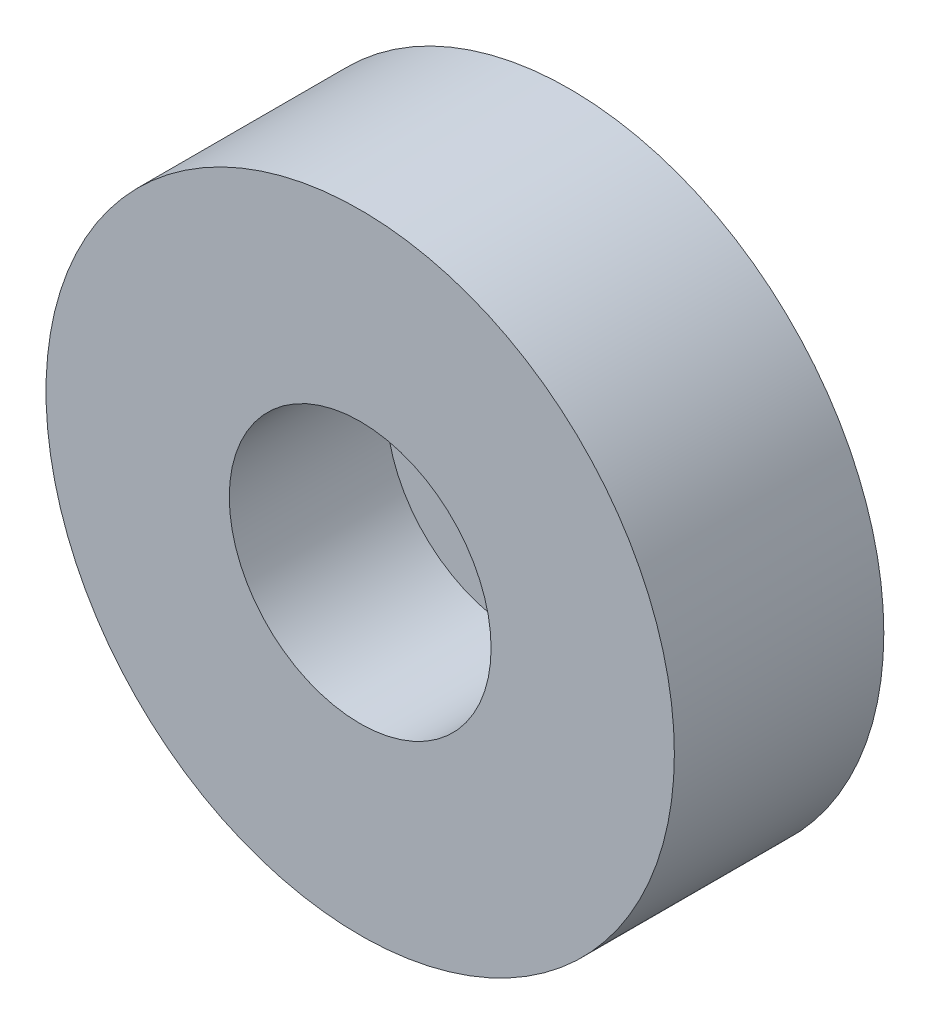
ISO-10303-21;
HEADER;
FILE_DESCRIPTION(('STEP AP214'),'2;1');
FILE_NAME('part.step','',(''),(''),'','','');
FILE_SCHEMA(('AUTOMOTIVE_DESIGN { 1 0 10303 214 1 1 1 1 }'));
ENDSEC;
DATA;
#1=APPLICATION_CONTEXT('core data for automotive mechanical design processes');
#2=APPLICATION_PROTOCOL_DEFINITION('international standard','automotive_design',2000,#1);
#3=PRODUCT_CONTEXT('',#1,'mechanical');
#4=PRODUCT('Part','Part','',(#3));
#5=PRODUCT_RELATED_PRODUCT_CATEGORY('part','',(#4));
#6=PRODUCT_DEFINITION_FORMATION('','',#4);
#7=PRODUCT_DEFINITION_CONTEXT('part definition',#1,'design');
#8=PRODUCT_DEFINITION('design','',#6,#7);
#9=PRODUCT_DEFINITION_SHAPE('','',#8);
#10=(LENGTH_UNIT() NAMED_UNIT(*) SI_UNIT(.MILLI.,.METRE.));
#11=(NAMED_UNIT(*) PLANE_ANGLE_UNIT() SI_UNIT($,.RADIAN.));
#12=(NAMED_UNIT(*) SI_UNIT($,.STERADIAN.) SOLID_ANGLE_UNIT());
#13=UNCERTAINTY_MEASURE_WITH_UNIT(LENGTH_MEASURE(1.E-05),#10,'distance_accuracy_value','');
#14=(GEOMETRIC_REPRESENTATION_CONTEXT(3) GLOBAL_UNCERTAINTY_ASSIGNED_CONTEXT((#13)) GLOBAL_UNIT_ASSIGNED_CONTEXT((#10,
#11,#12)) REPRESENTATION_CONTEXT('',''));
#15=CARTESIAN_POINT('',(0.,0.,0.));
#16=DIRECTION('',(0.,0.,1.));
#17=DIRECTION('',(1.,0.,0.));
#18=AXIS2_PLACEMENT_3D('',#15,#16,#17);
#19=CARTESIAN_POINT('',(0.,0.,40.));
#20=DIRECTION('',(0.,0.,-1.));
#21=DIRECTION('',(-1.,0.,0.));
#22=AXIS2_PLACEMENT_3D('',#19,#20,#21);
#23=CYLINDRICAL_SURFACE('',#22,60.);
#24=CARTESIAN_POINT('',(0.,0.,40.));
#25=DIRECTION('',(0.,0.,1.));
#26=DIRECTION('',(1.,0.,0.));
#27=AXIS2_PLACEMENT_3D('',#24,#25,#26);
#28=CIRCLE('',#27,60.);
#29=CARTESIAN_POINT('',(60.,0.,40.));
#30=VERTEX_POINT('',#29);
#31=EDGE_CURVE('E10',#30,#30,#28,.T.);
#32=ORIENTED_EDGE('',*,*,#31,.F.);
#33=EDGE_LOOP('',(#32));
#34=FACE_BOUND('',#33,.T.);
#35=CARTESIAN_POINT('',(0.,0.,0.));
#36=DIRECTION('',(0.,0.,1.));
#37=DIRECTION('',(1.,0.,0.));
#38=AXIS2_PLACEMENT_3D('',#35,#36,#37);
#39=CIRCLE('',#38,60.);
#40=CARTESIAN_POINT('',(60.,0.,0.));
#41=VERTEX_POINT('',#40);
#42=EDGE_CURVE('E46',#41,#41,#39,.T.);
#43=ORIENTED_EDGE('',*,*,#42,.T.);
#44=EDGE_LOOP('',(#43));
#45=FACE_BOUND('',#44,.T.);
#46=ADVANCED_FACE('F43',(#34,#45),#23,.T.);
#47=CARTESIAN_POINT('',(0.,0.,40.));
#48=DIRECTION('',(0.,0.,1.));
#49=DIRECTION('',(1.,0.,0.));
#50=AXIS2_PLACEMENT_3D('',#47,#48,#49);
#51=PLANE('',#50);
#52=CARTESIAN_POINT('',(0.,0.,40.));
#53=DIRECTION('',(0.,0.,1.));
#54=DIRECTION('',(1.,0.,0.));
#55=AXIS2_PLACEMENT_3D('',#52,#53,#54);
#56=CIRCLE('',#55,25.);
#57=CARTESIAN_POINT('',(25.,0.,40.));
#58=VERTEX_POINT('',#57);
#59=EDGE_CURVE('E57',#58,#58,#56,.T.);
#60=ORIENTED_EDGE('',*,*,#59,.F.);
#61=EDGE_LOOP('',(#60));
#62=FACE_BOUND('',#61,.T.);
#63=ORIENTED_EDGE('',*,*,#31,.T.);
#64=EDGE_LOOP('',(#63));
#65=FACE_BOUND('',#64,.T.);
#66=ADVANCED_FACE('F74',(#62,#65),#51,.T.);
#67=CARTESIAN_POINT('',(0.,0.,0.));
#68=DIRECTION('',(0.,0.,1.));
#69=DIRECTION('',(1.,0.,0.));
#70=AXIS2_PLACEMENT_3D('',#67,#68,#69);
#71=PLANE('',#70);
#72=ORIENTED_EDGE('',*,*,#42,.F.);
#73=EDGE_LOOP('',(#72));
#74=FACE_BOUND('',#73,.T.);
#75=ADVANCED_FACE('F70',(#74),#71,.F.);
#76=CARTESIAN_POINT('',(0.,0.,10.));
#77=DIRECTION('',(0.,0.,1.));
#78=DIRECTION('',(1.,0.,0.));
#79=AXIS2_PLACEMENT_3D('',#76,#77,#78);
#80=CYLINDRICAL_SURFACE('',#79,25.);
#81=CARTESIAN_POINT('',(0.,0.,10.));
#82=DIRECTION('',(0.,0.,1.));
#83=DIRECTION('',(1.,0.,0.));
#84=AXIS2_PLACEMENT_3D('',#81,#82,#83);
#85=CIRCLE('',#84,25.);
#86=CARTESIAN_POINT('',(25.,0.,10.));
#87=VERTEX_POINT('',#86);
#88=EDGE_CURVE('E55',#87,#87,#85,.T.);
#89=ORIENTED_EDGE('',*,*,#88,.F.);
#90=EDGE_LOOP('',(#89));
#91=FACE_BOUND('',#90,.T.);
#92=ORIENTED_EDGE('',*,*,#59,.T.);
#93=EDGE_LOOP('',(#92));
#94=FACE_BOUND('',#93,.T.);
#95=ADVANCED_FACE('F67',(#91,#94),#80,.F.);
#96=CARTESIAN_POINT('',(0.,0.,10.));
#97=DIRECTION('',(0.,0.,1.));
#98=DIRECTION('',(1.,0.,0.));
#99=AXIS2_PLACEMENT_3D('',#96,#97,#98);
#100=PLANE('',#99);
#101=ORIENTED_EDGE('',*,*,#88,.T.);
#102=EDGE_LOOP('',(#101));
#103=FACE_BOUND('',#102,.T.);
#104=ADVANCED_FACE('F65',(#103),#100,.T.);
#105=CLOSED_SHELL('',(#46,#66,#75,#95,#104));
#106=MANIFOLD_SOLID_BREP('B2',#105);
#107=ADVANCED_BREP_SHAPE_REPRESENTATION('',(#18,#106),#14);
#108=SHAPE_DEFINITION_REPRESENTATION(#9,#107);
ENDSEC;
END-ISO-10303-21;
